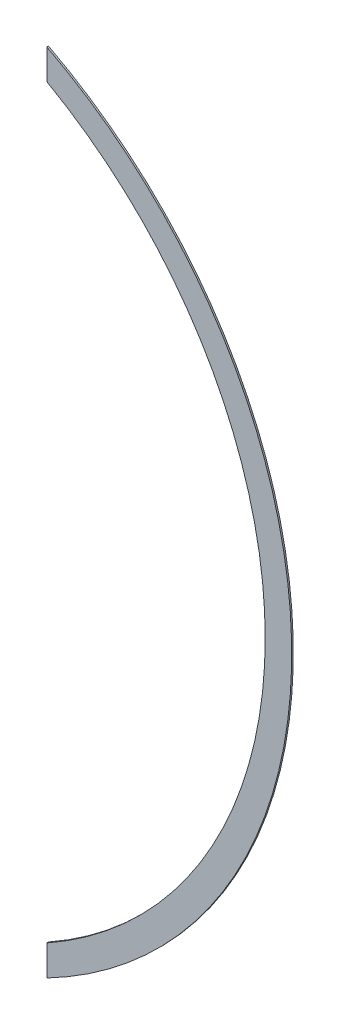
ISO-10303-21;
HEADER;
FILE_DESCRIPTION(('STEP AP214'),'2;1');
FILE_NAME('part.step','',(''),(''),'','','');
FILE_SCHEMA(('AUTOMOTIVE_DESIGN { 1 0 10303 214 1 1 1 1 }'));
ENDSEC;
DATA;
#1=APPLICATION_CONTEXT('core data for automotive mechanical design processes');
#2=APPLICATION_PROTOCOL_DEFINITION('international standard','automotive_design',2000,#1);
#3=PRODUCT_CONTEXT('',#1,'mechanical');
#4=PRODUCT('Part','Part','',(#3));
#5=PRODUCT_RELATED_PRODUCT_CATEGORY('part','',(#4));
#6=PRODUCT_DEFINITION_FORMATION('','',#4);
#7=PRODUCT_DEFINITION_CONTEXT('part definition',#1,'design');
#8=PRODUCT_DEFINITION('design','',#6,#7);
#9=PRODUCT_DEFINITION_SHAPE('','',#8);
#10=(LENGTH_UNIT() NAMED_UNIT(*) SI_UNIT(.MILLI.,.METRE.));
#11=(NAMED_UNIT(*) PLANE_ANGLE_UNIT() SI_UNIT($,.RADIAN.));
#12=(NAMED_UNIT(*) SI_UNIT($,.STERADIAN.) SOLID_ANGLE_UNIT());
#13=UNCERTAINTY_MEASURE_WITH_UNIT(LENGTH_MEASURE(1.E-05),#10,'distance_accuracy_value','');
#14=(GEOMETRIC_REPRESENTATION_CONTEXT(3) GLOBAL_UNCERTAINTY_ASSIGNED_CONTEXT((#13)) GLOBAL_UNIT_ASSIGNED_CONTEXT((#10,
#11,#12)) REPRESENTATION_CONTEXT('',''));
#15=CARTESIAN_POINT('',(0.,0.,0.));
#16=DIRECTION('',(0.,0.,1.));
#17=DIRECTION('',(1.,0.,0.));
#18=AXIS2_PLACEMENT_3D('',#15,#16,#17);
#19=CARTESIAN_POINT('',(-303.368887473295,6.86822146022914,1.5));
#20=DIRECTION('',(0.,0.,-1.));
#21=DIRECTION('',(-1.,0.,0.));
#22=AXIS2_PLACEMENT_3D('',#19,#20,#21);
#23=CYLINDRICAL_SURFACE('',#22,425.);
#24=CARTESIAN_POINT('',(-303.368887473295,6.86822146022914,0.));
#25=DIRECTION('',(0.,0.,1.));
#26=DIRECTION('',(1.,0.,0.));
#27=AXIS2_PLACEMENT_3D('',#24,#25,#26);
#28=CIRCLE('',#27,425.);
#29=CARTESIAN_POINT('',(-107.45222005366,-370.281164628604,0.));
#30=VERTEX_POINT('',#29);
#31=CARTESIAN_POINT('',(-107.45222005366,384.017607549063,0.));
#32=VERTEX_POINT('',#31);
#33=EDGE_CURVE('E95',#30,#32,#28,.T.);
#34=ORIENTED_EDGE('',*,*,#33,.T.);
#35=DIRECTION('',(0.,0.,-1.));
#36=VECTOR('',#35,1.);
#37=CARTESIAN_POINT('',(-107.45222005366,384.017607549063,1.5));
#38=LINE('',#37,#36);
#39=CARTESIAN_POINT('',(-107.45222005366,384.017607549063,1.5));
#40=VERTEX_POINT('',#39);
#41=EDGE_CURVE('E11',#40,#32,#38,.T.);
#42=ORIENTED_EDGE('',*,*,#41,.F.);
#43=CARTESIAN_POINT('',(-303.368887473295,6.86822146022914,1.5));
#44=DIRECTION('',(0.,0.,1.));
#45=DIRECTION('',(1.,0.,0.));
#46=AXIS2_PLACEMENT_3D('',#43,#44,#45);
#47=CIRCLE('',#46,425.);
#48=CARTESIAN_POINT('',(-107.45222005366,-370.281164628604,1.5));
#49=VERTEX_POINT('',#48);
#50=EDGE_CURVE('E83',#49,#40,#47,.T.);
#51=ORIENTED_EDGE('',*,*,#50,.F.);
#52=DIRECTION('',(0.,0.,-1.));
#53=VECTOR('',#52,1.);
#54=CARTESIAN_POINT('',(-107.45222005366,-370.281164628604,1.5));
#55=LINE('',#54,#53);
#56=EDGE_CURVE('E91',#49,#30,#55,.T.);
#57=ORIENTED_EDGE('',*,*,#56,.T.);
#58=EDGE_LOOP('',(#34,#42,#51,#57));
#59=FACE_BOUND('',#58,.T.);
#60=ADVANCED_FACE('F32',(#59),#23,.T.);
#61=CARTESIAN_POINT('',(-107.45222005366,355.837646969911,1.5));
#62=DIRECTION('',(1.,0.,0.));
#63=DIRECTION('',(0.,0.,-1.));
#64=AXIS2_PLACEMENT_3D('',#61,#62,#63);
#65=PLANE('',#64);
#66=DIRECTION('',(0.,-1.,0.));
#67=VECTOR('',#66,1.);
#68=CARTESIAN_POINT('',(-107.45222005366,355.837646969911,0.));
#69=LINE('',#68,#67);
#70=CARTESIAN_POINT('',(-107.45222005366,355.837646969911,0.));
#71=VERTEX_POINT('',#70);
#72=EDGE_CURVE('E87',#32,#71,#69,.T.);
#73=ORIENTED_EDGE('',*,*,#72,.T.);
#74=DIRECTION('',(0.,0.,-1.));
#75=VECTOR('',#74,1.);
#76=CARTESIAN_POINT('',(-107.45222005366,355.837646969911,1.5));
#77=LINE('',#76,#75);
#78=CARTESIAN_POINT('',(-107.45222005366,355.837646969911,1.5));
#79=VERTEX_POINT('',#78);
#80=EDGE_CURVE('E40',#79,#71,#77,.T.);
#81=ORIENTED_EDGE('',*,*,#80,.F.);
#82=DIRECTION('',(0.,-1.,0.));
#83=VECTOR('',#82,1.);
#84=CARTESIAN_POINT('',(-107.45222005366,355.837646969911,1.5));
#85=LINE('',#84,#83);
#86=EDGE_CURVE('E78',#40,#79,#85,.T.);
#87=ORIENTED_EDGE('',*,*,#86,.F.);
#88=ORIENTED_EDGE('',*,*,#41,.T.);
#89=EDGE_LOOP('',(#73,#81,#87,#88));
#90=FACE_BOUND('',#89,.T.);
#91=ADVANCED_FACE('F86',(#90),#65,.F.);
#92=CARTESIAN_POINT('',(-303.156779930096,6.98276991704466,1.5));
#93=DIRECTION('',(0.,0.,-1.));
#94=DIRECTION('',(-1.,0.,0.));
#95=AXIS2_PLACEMENT_3D('',#92,#93,#94);
#96=CYLINDRICAL_SURFACE('',#95,400.);
#97=CARTESIAN_POINT('',(-303.156779930096,6.98276991704466,0.));
#98=DIRECTION('',(0.,0.,-1.));
#99=DIRECTION('',(1.,0.,0.));
#100=AXIS2_PLACEMENT_3D('',#97,#98,#99);
#101=CIRCLE('',#100,400.);
#102=CARTESIAN_POINT('',(-107.45222005366,-341.872107135821,0.));
#103=VERTEX_POINT('',#102);
#104=EDGE_CURVE('E65',#71,#103,#101,.T.);
#105=ORIENTED_EDGE('',*,*,#104,.T.);
#106=DIRECTION('',(0.,0.,-1.));
#107=VECTOR('',#106,1.);
#108=CARTESIAN_POINT('',(-107.45222005366,-341.872107135821,1.5));
#109=LINE('',#108,#107);
#110=CARTESIAN_POINT('',(-107.45222005366,-341.872107135821,1.5));
#111=VERTEX_POINT('',#110);
#112=EDGE_CURVE('E88',#111,#103,#109,.T.);
#113=ORIENTED_EDGE('',*,*,#112,.F.);
#114=CARTESIAN_POINT('',(-303.156779930096,6.98276991704466,1.5));
#115=DIRECTION('',(0.,0.,-1.));
#116=DIRECTION('',(1.,0.,0.));
#117=AXIS2_PLACEMENT_3D('',#114,#115,#116);
#118=CIRCLE('',#117,400.);
#119=EDGE_CURVE('E81',#79,#111,#118,.T.);
#120=ORIENTED_EDGE('',*,*,#119,.F.);
#121=ORIENTED_EDGE('',*,*,#80,.T.);
#122=EDGE_LOOP('',(#105,#113,#120,#121));
#123=FACE_BOUND('',#122,.T.);
#124=ADVANCED_FACE('F89',(#123),#96,.F.);
#125=CARTESIAN_POINT('',(-107.45222005366,-370.281164628604,1.5));
#126=DIRECTION('',(1.,0.,0.));
#127=DIRECTION('',(0.,0.,-1.));
#128=AXIS2_PLACEMENT_3D('',#125,#126,#127);
#129=PLANE('',#128);
#130=DIRECTION('',(0.,-1.,0.));
#131=VECTOR('',#130,1.);
#132=CARTESIAN_POINT('',(-107.45222005366,-370.281164628604,0.));
#133=LINE('',#132,#131);
#134=EDGE_CURVE('E71',#103,#30,#133,.T.);
#135=ORIENTED_EDGE('',*,*,#134,.T.);
#136=ORIENTED_EDGE('',*,*,#56,.F.);
#137=DIRECTION('',(0.,-1.,0.));
#138=VECTOR('',#137,1.);
#139=CARTESIAN_POINT('',(-107.45222005366,-370.281164628604,1.5));
#140=LINE('',#139,#138);
#141=EDGE_CURVE('E48',#111,#49,#140,.T.);
#142=ORIENTED_EDGE('',*,*,#141,.F.);
#143=ORIENTED_EDGE('',*,*,#112,.T.);
#144=EDGE_LOOP('',(#135,#136,#142,#143));
#145=FACE_BOUND('',#144,.T.);
#146=ADVANCED_FACE('F102',(#145),#129,.F.);
#147=CARTESIAN_POINT('',(-303.368887473295,6.86822146022914,1.5));
#148=DIRECTION('',(0.,0.,1.));
#149=DIRECTION('',(1.,0.,0.));
#150=AXIS2_PLACEMENT_3D('',#147,#148,#149);
#151=PLANE('',#150);
#152=ORIENTED_EDGE('',*,*,#50,.T.);
#153=ORIENTED_EDGE('',*,*,#86,.T.);
#154=ORIENTED_EDGE('',*,*,#119,.T.);
#155=ORIENTED_EDGE('',*,*,#141,.T.);
#156=EDGE_LOOP('',(#152,#153,#154,#155));
#157=FACE_BOUND('',#156,.T.);
#158=ADVANCED_FACE('F79',(#157),#151,.T.);
#159=CARTESIAN_POINT('',(-303.368887473295,6.86822146022914,0.));
#160=DIRECTION('',(0.,0.,1.));
#161=DIRECTION('',(1.,0.,0.));
#162=AXIS2_PLACEMENT_3D('',#159,#160,#161);
#163=PLANE('',#162);
#164=ORIENTED_EDGE('',*,*,#33,.F.);
#165=ORIENTED_EDGE('',*,*,#134,.F.);
#166=ORIENTED_EDGE('',*,*,#104,.F.);
#167=ORIENTED_EDGE('',*,*,#72,.F.);
#168=EDGE_LOOP('',(#164,#165,#166,#167));
#169=FACE_BOUND('',#168,.T.);
#170=ADVANCED_FACE('F105',(#169),#163,.F.);
#171=CLOSED_SHELL('',(#60,#91,#124,#146,#158,#170));
#172=MANIFOLD_SOLID_BREP('B2',#171);
#173=ADVANCED_BREP_SHAPE_REPRESENTATION('',(#18,#172),#14);
#174=SHAPE_DEFINITION_REPRESENTATION(#9,#173);
ENDSEC;
END-ISO-10303-21;
